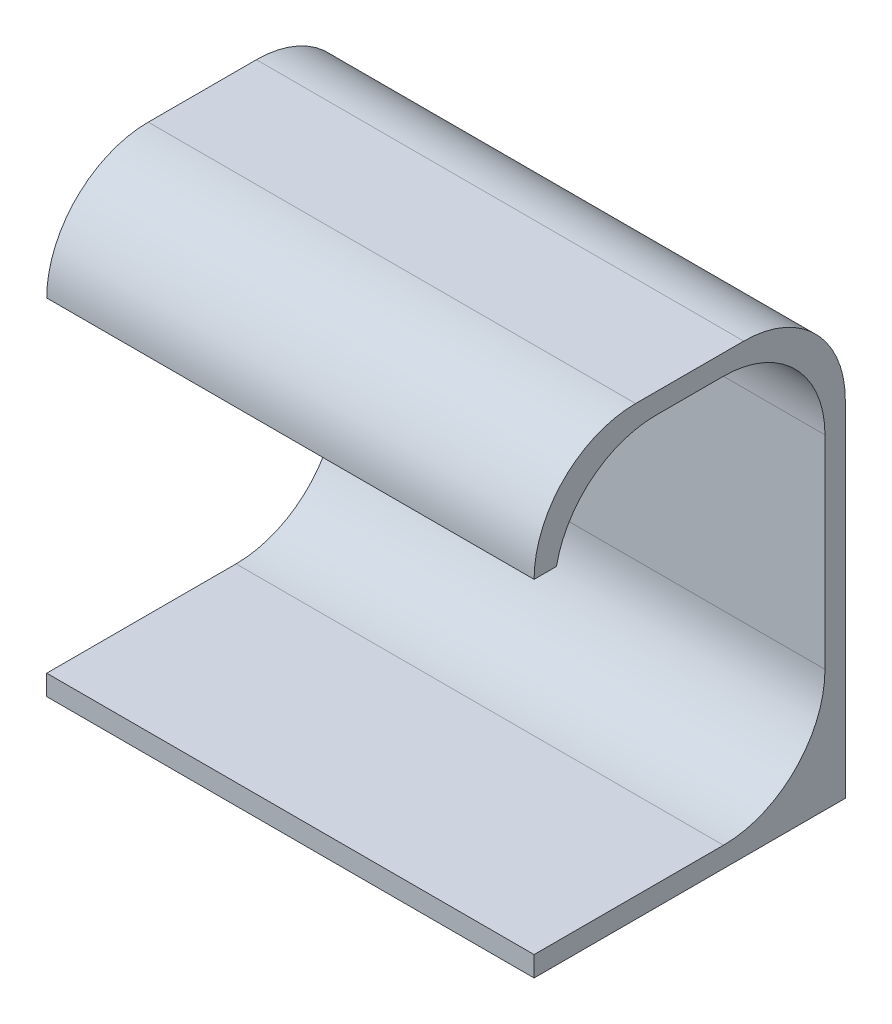
ISO-10303-21;
HEADER;
FILE_DESCRIPTION(('STEP AP214'),'2;1');
FILE_NAME('part.step','',(''),(''),'','','');
FILE_SCHEMA(('AUTOMOTIVE_DESIGN { 1 0 10303 214 1 1 1 1 }'));
ENDSEC;
DATA;
#1=APPLICATION_CONTEXT('core data for automotive mechanical design processes');
#2=APPLICATION_PROTOCOL_DEFINITION('international standard','automotive_design',2000,#1);
#3=PRODUCT_CONTEXT('',#1,'mechanical');
#4=PRODUCT('Part','Part','',(#3));
#5=PRODUCT_RELATED_PRODUCT_CATEGORY('part','',(#4));
#6=PRODUCT_DEFINITION_FORMATION('','',#4);
#7=PRODUCT_DEFINITION_CONTEXT('part definition',#1,'design');
#8=PRODUCT_DEFINITION('design','',#6,#7);
#9=PRODUCT_DEFINITION_SHAPE('','',#8);
#10=(LENGTH_UNIT() NAMED_UNIT(*) SI_UNIT(.MILLI.,.METRE.));
#11=(NAMED_UNIT(*) PLANE_ANGLE_UNIT() SI_UNIT($,.RADIAN.));
#12=(NAMED_UNIT(*) SI_UNIT($,.STERADIAN.) SOLID_ANGLE_UNIT());
#13=UNCERTAINTY_MEASURE_WITH_UNIT(LENGTH_MEASURE(1.E-05),#10,'distance_accuracy_value','');
#14=(GEOMETRIC_REPRESENTATION_CONTEXT(3) GLOBAL_UNCERTAINTY_ASSIGNED_CONTEXT((#13)) GLOBAL_UNIT_ASSIGNED_CONTEXT((#10,
#11,#12)) REPRESENTATION_CONTEXT('',''));
#15=CARTESIAN_POINT('',(0.,0.,0.));
#16=DIRECTION('',(0.,0.,1.));
#17=DIRECTION('',(1.,0.,0.));
#18=AXIS2_PLACEMENT_3D('',#15,#16,#17);
#19=CARTESIAN_POINT('',(48.,-2.,-17.25));
#20=DIRECTION('',(-1.,0.,0.));
#21=DIRECTION('',(0.,0.,1.));
#22=AXIS2_PLACEMENT_3D('',#19,#20,#21);
#23=PLANE('',#22);
#24=CARTESIAN_POINT('',(48.,-2.,-17.25));
#25=DIRECTION('',(1.,0.,0.));
#26=DIRECTION('',(0.,0.,1.));
#27=AXIS2_PLACEMENT_3D('',#24,#25,#26);
#28=CIRCLE('',#27,10.);
#29=CARTESIAN_POINT('',(48.,8.00000000000001,-17.25));
#30=VERTEX_POINT('',#29);
#31=CARTESIAN_POINT('',(48.,-2.,-7.25));
#32=VERTEX_POINT('',#31);
#33=EDGE_CURVE('E117',#30,#32,#28,.T.);
#34=ORIENTED_EDGE('',*,*,#33,.T.);
#35=DIRECTION('',(0.,0.,-1.));
#36=VECTOR('',#35,1.);
#37=CARTESIAN_POINT('',(48.,-2.,-17.25));
#38=LINE('',#37,#36);
#39=CARTESIAN_POINT('',(48.,-2.,-9.45204102886729));
#40=VERTEX_POINT('',#39);
#41=EDGE_CURVE('E158',#32,#40,#38,.T.);
#42=ORIENTED_EDGE('',*,*,#41,.T.);
#43=CARTESIAN_POINT('',(48.,-4.,-19.25));
#44=DIRECTION('',(1.,0.,0.));
#45=DIRECTION('',(0.,0.,1.));
#46=AXIS2_PLACEMENT_3D('',#43,#44,#45);
#47=CIRCLE('',#46,10.);
#48=CARTESIAN_POINT('',(48.,6.,-19.25));
#49=VERTEX_POINT('',#48);
#50=EDGE_CURVE('E206',#49,#40,#47,.T.);
#51=ORIENTED_EDGE('',*,*,#50,.F.);
#52=DIRECTION('',(0.,0.,1.));
#53=VECTOR('',#52,1.);
#54=CARTESIAN_POINT('',(48.,6.,-19.25));
#55=LINE('',#54,#53);
#56=CARTESIAN_POINT('',(48.,6.,-25.9));
#57=VERTEX_POINT('',#56);
#58=EDGE_CURVE('E204',#57,#49,#55,.T.);
#59=ORIENTED_EDGE('',*,*,#58,.F.);
#60=CARTESIAN_POINT('',(48.,-4.,-25.9));
#61=DIRECTION('',(1.,0.,0.));
#62=DIRECTION('',(0.,0.,1.));
#63=AXIS2_PLACEMENT_3D('',#60,#61,#62);
#64=CIRCLE('',#63,10.);
#65=CARTESIAN_POINT('',(48.,-4.,-35.9));
#66=VERTEX_POINT('',#65);
#67=EDGE_CURVE('E350',#66,#57,#64,.T.);
#68=ORIENTED_EDGE('',*,*,#67,.F.);
#69=DIRECTION('',(0.,1.,0.));
#70=VECTOR('',#69,1.);
#71=CARTESIAN_POINT('',(48.,-20.3,-35.9));
#72=LINE('',#71,#70);
#73=CARTESIAN_POINT('',(48.,-23.9999999999999,-35.9));
#74=VERTEX_POINT('',#73);
#75=EDGE_CURVE('E251',#74,#66,#72,.T.);
#76=ORIENTED_EDGE('',*,*,#75,.F.);
#77=CARTESIAN_POINT('',(48.,-24.,-25.9));
#78=DIRECTION('',(1.,0.,0.));
#79=DIRECTION('',(0.,0.,1.));
#80=AXIS2_PLACEMENT_3D('',#77,#78,#79);
#81=CIRCLE('',#80,10.);
#82=CARTESIAN_POINT('',(48.,-34.,-25.8999999999999));
#83=VERTEX_POINT('',#82);
#84=EDGE_CURVE('E347',#83,#74,#81,.T.);
#85=ORIENTED_EDGE('',*,*,#84,.F.);
#86=DIRECTION('',(0.,0.,-1.));
#87=VECTOR('',#86,1.);
#88=CARTESIAN_POINT('',(48.,-34.,-25.8999999999999));
#89=LINE('',#88,#87);
#90=CARTESIAN_POINT('',(48.,-34.,-7.25));
#91=VERTEX_POINT('',#90);
#92=EDGE_CURVE('E212',#91,#83,#89,.T.);
#93=ORIENTED_EDGE('',*,*,#92,.F.);
#94=DIRECTION('',(0.,-1.,0.));
#95=VECTOR('',#94,1.);
#96=CARTESIAN_POINT('',(48.,-36.,-7.25));
#97=LINE('',#96,#95);
#98=CARTESIAN_POINT('',(48.,-36.,-7.25));
#99=VERTEX_POINT('',#98);
#100=EDGE_CURVE('E89',#91,#99,#97,.T.);
#101=ORIENTED_EDGE('',*,*,#100,.T.);
#102=DIRECTION('',(0.,0.,-1.));
#103=VECTOR('',#102,1.);
#104=CARTESIAN_POINT('',(48.,-36.,-37.9));
#105=LINE('',#104,#103);
#106=CARTESIAN_POINT('',(48.,-36.,-37.9));
#107=VERTEX_POINT('',#106);
#108=EDGE_CURVE('E102',#99,#107,#105,.T.);
#109=ORIENTED_EDGE('',*,*,#108,.T.);
#110=DIRECTION('',(0.,1.,0.));
#111=VECTOR('',#110,1.);
#112=CARTESIAN_POINT('',(48.,-20.3,-37.9));
#113=LINE('',#112,#111);
#114=CARTESIAN_POINT('',(48.,-1.99999999999999,-37.9));
#115=VERTEX_POINT('',#114);
#116=EDGE_CURVE('E97',#107,#115,#113,.T.);
#117=ORIENTED_EDGE('',*,*,#116,.T.);
#118=CARTESIAN_POINT('',(48.,-2.,-27.9));
#119=DIRECTION('',(1.,0.,0.));
#120=DIRECTION('',(0.,0.,1.));
#121=AXIS2_PLACEMENT_3D('',#118,#119,#120);
#122=CIRCLE('',#121,10.);
#123=CARTESIAN_POINT('',(48.,8.,-27.9));
#124=VERTEX_POINT('',#123);
#125=EDGE_CURVE('E100',#115,#124,#122,.T.);
#126=ORIENTED_EDGE('',*,*,#125,.T.);
#127=DIRECTION('',(0.,0.,1.));
#128=VECTOR('',#127,1.);
#129=CARTESIAN_POINT('',(48.,8.,-17.25));
#130=LINE('',#129,#128);
#131=EDGE_CURVE('E57',#124,#30,#130,.T.);
#132=ORIENTED_EDGE('',*,*,#131,.T.);
#133=EDGE_LOOP('',(#34,#42,#51,#59,#68,#76,#85,#93,#101,#109,#117,#126,#132));
#134=FACE_BOUND('',#133,.T.);
#135=ADVANCED_FACE('F33',(#134),#23,.F.);
#136=CARTESIAN_POINT('',(0.,-2.,-17.25));
#137=DIRECTION('',(-1.,0.,0.));
#138=DIRECTION('',(0.,0.,1.));
#139=AXIS2_PLACEMENT_3D('',#136,#137,#138);
#140=PLANE('',#139);
#141=DIRECTION('',(0.,0.,-1.));
#142=VECTOR('',#141,1.);
#143=CARTESIAN_POINT('',(0.,-2.,-7.25));
#144=LINE('',#143,#142);
#145=CARTESIAN_POINT('',(0.,-2.,-7.25));
#146=VERTEX_POINT('',#145);
#147=CARTESIAN_POINT('',(0.,-2.,-9.45204102886729));
#148=VERTEX_POINT('',#147);
#149=EDGE_CURVE('E48',#146,#148,#144,.T.);
#150=ORIENTED_EDGE('',*,*,#149,.F.);
#151=CARTESIAN_POINT('',(0.,-2.,-17.25));
#152=DIRECTION('',(1.,0.,0.));
#153=DIRECTION('',(0.,0.,1.));
#154=AXIS2_PLACEMENT_3D('',#151,#152,#153);
#155=CIRCLE('',#154,10.);
#156=CARTESIAN_POINT('',(0.,8.00000000000001,-17.25));
#157=VERTEX_POINT('',#156);
#158=EDGE_CURVE('E131',#157,#146,#155,.T.);
#159=ORIENTED_EDGE('',*,*,#158,.F.);
#160=DIRECTION('',(0.,0.,1.));
#161=VECTOR('',#160,1.);
#162=CARTESIAN_POINT('',(0.,8.,-17.25));
#163=LINE('',#162,#161);
#164=CARTESIAN_POINT('',(0.,8.,-27.9));
#165=VERTEX_POINT('',#164);
#166=EDGE_CURVE('E81',#165,#157,#163,.T.);
#167=ORIENTED_EDGE('',*,*,#166,.F.);
#168=CARTESIAN_POINT('',(0.,-2.,-27.9));
#169=DIRECTION('',(1.,0.,0.));
#170=DIRECTION('',(0.,0.,1.));
#171=AXIS2_PLACEMENT_3D('',#168,#169,#170);
#172=CIRCLE('',#171,10.);
#173=CARTESIAN_POINT('',(0.,-1.99999999999999,-37.9));
#174=VERTEX_POINT('',#173);
#175=EDGE_CURVE('E128',#174,#165,#172,.T.);
#176=ORIENTED_EDGE('',*,*,#175,.F.);
#177=DIRECTION('',(0.,1.,0.));
#178=VECTOR('',#177,1.);
#179=CARTESIAN_POINT('',(0.,-1.99999999999999,-37.9));
#180=LINE('',#179,#178);
#181=CARTESIAN_POINT('',(0.,-36.,-37.9));
#182=VERTEX_POINT('',#181);
#183=EDGE_CURVE('E110',#182,#174,#180,.T.);
#184=ORIENTED_EDGE('',*,*,#183,.F.);
#185=DIRECTION('',(0.,0.,-1.));
#186=VECTOR('',#185,1.);
#187=CARTESIAN_POINT('',(0.,-36.,-37.9));
#188=LINE('',#187,#186);
#189=CARTESIAN_POINT('',(0.,-36.,-7.25));
#190=VERTEX_POINT('',#189);
#191=EDGE_CURVE('E123',#190,#182,#188,.T.);
#192=ORIENTED_EDGE('',*,*,#191,.F.);
#193=DIRECTION('',(0.,-1.,0.));
#194=VECTOR('',#193,1.);
#195=CARTESIAN_POINT('',(0.,-20.3,-7.25));
#196=LINE('',#195,#194);
#197=CARTESIAN_POINT('',(0.,-34.,-7.25));
#198=VERTEX_POINT('',#197);
#199=EDGE_CURVE('E134',#198,#190,#196,.T.);
#200=ORIENTED_EDGE('',*,*,#199,.F.);
#201=DIRECTION('',(0.,0.,-1.));
#202=VECTOR('',#201,1.);
#203=CARTESIAN_POINT('',(0.,-34.,-25.8999999999999));
#204=LINE('',#203,#202);
#205=CARTESIAN_POINT('',(0.,-34.,-25.8999999999999));
#206=VERTEX_POINT('',#205);
#207=EDGE_CURVE('E234',#198,#206,#204,.T.);
#208=ORIENTED_EDGE('',*,*,#207,.T.);
#209=CARTESIAN_POINT('',(0.,-24.,-25.9));
#210=DIRECTION('',(1.,0.,0.));
#211=DIRECTION('',(0.,0.,1.));
#212=AXIS2_PLACEMENT_3D('',#209,#210,#211);
#213=CIRCLE('',#212,10.);
#214=CARTESIAN_POINT('',(0.,-23.9999999999999,-35.9));
#215=VERTEX_POINT('',#214);
#216=EDGE_CURVE('E239',#206,#215,#213,.T.);
#217=ORIENTED_EDGE('',*,*,#216,.T.);
#218=DIRECTION('',(0.,1.,0.));
#219=VECTOR('',#218,1.);
#220=CARTESIAN_POINT('',(0.,-4.,-35.9));
#221=LINE('',#220,#219);
#222=CARTESIAN_POINT('',(0.,-4.,-35.9));
#223=VERTEX_POINT('',#222);
#224=EDGE_CURVE('E217',#215,#223,#221,.T.);
#225=ORIENTED_EDGE('',*,*,#224,.T.);
#226=CARTESIAN_POINT('',(0.,-4.,-25.9));
#227=DIRECTION('',(1.,0.,0.));
#228=DIRECTION('',(0.,0.,1.));
#229=AXIS2_PLACEMENT_3D('',#226,#227,#228);
#230=CIRCLE('',#229,10.);
#231=CARTESIAN_POINT('',(0.,6.,-25.9));
#232=VERTEX_POINT('',#231);
#233=EDGE_CURVE('E215',#223,#232,#230,.T.);
#234=ORIENTED_EDGE('',*,*,#233,.T.);
#235=DIRECTION('',(0.,0.,1.));
#236=VECTOR('',#235,1.);
#237=CARTESIAN_POINT('',(0.,6.,-19.25));
#238=LINE('',#237,#236);
#239=CARTESIAN_POINT('',(0.,6.,-19.25));
#240=VERTEX_POINT('',#239);
#241=EDGE_CURVE('E201',#232,#240,#238,.T.);
#242=ORIENTED_EDGE('',*,*,#241,.T.);
#243=CARTESIAN_POINT('',(0.,-4.,-19.25));
#244=DIRECTION('',(1.,0.,0.));
#245=DIRECTION('',(0.,0.,1.));
#246=AXIS2_PLACEMENT_3D('',#243,#244,#245);
#247=CIRCLE('',#246,10.);
#248=EDGE_CURVE('E209',#240,#148,#247,.T.);
#249=ORIENTED_EDGE('',*,*,#248,.T.);
#250=EDGE_LOOP('',(#150,#159,#167,#176,#184,#192,#200,#208,#217,#225,#234,#242,#249));
#251=FACE_BOUND('',#250,.T.);
#252=ADVANCED_FACE('F144',(#251),#140,.T.);
#253=CARTESIAN_POINT('',(48.,-36.,-37.9));
#254=DIRECTION('',(0.,1.,0.));
#255=DIRECTION('',(0.,0.,1.));
#256=AXIS2_PLACEMENT_3D('',#253,#254,#255);
#257=PLANE('',#256);
#258=ORIENTED_EDGE('',*,*,#191,.T.);
#259=DIRECTION('',(-1.,0.,0.));
#260=VECTOR('',#259,1.);
#261=CARTESIAN_POINT('',(48.,-36.,-37.9));
#262=LINE('',#261,#260);
#263=EDGE_CURVE('E41',#107,#182,#262,.T.);
#264=ORIENTED_EDGE('',*,*,#263,.F.);
#265=ORIENTED_EDGE('',*,*,#108,.F.);
#266=DIRECTION('',(-1.,0.,0.));
#267=VECTOR('',#266,1.);
#268=CARTESIAN_POINT('',(48.,-36.,-7.25));
#269=LINE('',#268,#267);
#270=EDGE_CURVE('E11',#99,#190,#269,.T.);
#271=ORIENTED_EDGE('',*,*,#270,.T.);
#272=EDGE_LOOP('',(#258,#264,#265,#271));
#273=FACE_BOUND('',#272,.T.);
#274=ADVANCED_FACE('F35',(#273),#257,.F.);
#275=CARTESIAN_POINT('',(48.,-1.99999999999999,-37.9));
#276=DIRECTION('',(0.,0.,1.));
#277=DIRECTION('',(0.,-1.,0.));
#278=AXIS2_PLACEMENT_3D('',#275,#276,#277);
#279=PLANE('',#278);
#280=ORIENTED_EDGE('',*,*,#183,.T.);
#281=DIRECTION('',(-1.,0.,0.));
#282=VECTOR('',#281,1.);
#283=CARTESIAN_POINT('',(48.,-1.99999999999999,-37.9));
#284=LINE('',#283,#282);
#285=EDGE_CURVE('E108',#115,#174,#284,.T.);
#286=ORIENTED_EDGE('',*,*,#285,.F.);
#287=ORIENTED_EDGE('',*,*,#116,.F.);
#288=ORIENTED_EDGE('',*,*,#263,.T.);
#289=EDGE_LOOP('',(#280,#286,#287,#288));
#290=FACE_BOUND('',#289,.T.);
#291=ADVANCED_FACE('F109',(#290),#279,.F.);
#292=CARTESIAN_POINT('',(48.,-2.,-27.9));
#293=DIRECTION('',(-1.,0.,0.));
#294=DIRECTION('',(0.,0.,1.));
#295=AXIS2_PLACEMENT_3D('',#292,#293,#294);
#296=CYLINDRICAL_SURFACE('',#295,10.);
#297=ORIENTED_EDGE('',*,*,#175,.T.);
#298=DIRECTION('',(-1.,0.,0.));
#299=VECTOR('',#298,1.);
#300=CARTESIAN_POINT('',(48.,8.,-27.9));
#301=LINE('',#300,#299);
#302=EDGE_CURVE('E113',#124,#165,#301,.T.);
#303=ORIENTED_EDGE('',*,*,#302,.F.);
#304=ORIENTED_EDGE('',*,*,#125,.F.);
#305=ORIENTED_EDGE('',*,*,#285,.T.);
#306=EDGE_LOOP('',(#297,#303,#304,#305));
#307=FACE_BOUND('',#306,.T.);
#308=ADVANCED_FACE('F115',(#307),#296,.T.);
#309=CARTESIAN_POINT('',(48.,8.,-17.25));
#310=DIRECTION('',(0.,-1.,0.));
#311=DIRECTION('',(0.,0.,-1.));
#312=AXIS2_PLACEMENT_3D('',#309,#310,#311);
#313=PLANE('',#312);
#314=ORIENTED_EDGE('',*,*,#166,.T.);
#315=DIRECTION('',(-1.,0.,0.));
#316=VECTOR('',#315,1.);
#317=CARTESIAN_POINT('',(48.,8.00000000000001,-17.25));
#318=LINE('',#317,#316);
#319=EDGE_CURVE('E137',#30,#157,#318,.T.);
#320=ORIENTED_EDGE('',*,*,#319,.F.);
#321=ORIENTED_EDGE('',*,*,#131,.F.);
#322=ORIENTED_EDGE('',*,*,#302,.T.);
#323=EDGE_LOOP('',(#314,#320,#321,#322));
#324=FACE_BOUND('',#323,.T.);
#325=ADVANCED_FACE('F148',(#324),#313,.F.);
#326=CARTESIAN_POINT('',(48.,-2.,-17.25));
#327=DIRECTION('',(-1.,0.,0.));
#328=DIRECTION('',(0.,0.,1.));
#329=AXIS2_PLACEMENT_3D('',#326,#327,#328);
#330=CYLINDRICAL_SURFACE('',#329,10.);
#331=ORIENTED_EDGE('',*,*,#158,.T.);
#332=DIRECTION('',(-1.,0.,0.));
#333=VECTOR('',#332,1.);
#334=CARTESIAN_POINT('',(48.,-2.,-7.25));
#335=LINE('',#334,#333);
#336=EDGE_CURVE('E122',#32,#146,#335,.T.);
#337=ORIENTED_EDGE('',*,*,#336,.F.);
#338=ORIENTED_EDGE('',*,*,#33,.F.);
#339=ORIENTED_EDGE('',*,*,#319,.T.);
#340=EDGE_LOOP('',(#331,#337,#338,#339));
#341=FACE_BOUND('',#340,.T.);
#342=ADVANCED_FACE('F152',(#341),#330,.T.);
#343=CARTESIAN_POINT('',(48.,-20.3,-7.25));
#344=DIRECTION('',(0.,0.,-1.));
#345=DIRECTION('',(0.,1.,0.));
#346=AXIS2_PLACEMENT_3D('',#343,#344,#345);
#347=PLANE('',#346);
#348=ORIENTED_EDGE('',*,*,#100,.F.);
#349=DIRECTION('',(-1.,0.,0.));
#350=VECTOR('',#349,1.);
#351=CARTESIAN_POINT('',(54.,-34.,-7.25));
#352=LINE('',#351,#350);
#353=EDGE_CURVE('E341',#91,#198,#352,.T.);
#354=ORIENTED_EDGE('',*,*,#353,.T.);
#355=ORIENTED_EDGE('',*,*,#199,.T.);
#356=ORIENTED_EDGE('',*,*,#270,.F.);
#357=EDGE_LOOP('',(#348,#354,#355,#356));
#358=FACE_BOUND('',#357,.T.);
#359=ADVANCED_FACE('F271',(#358),#347,.F.);
#360=CARTESIAN_POINT('',(48.,-34.,-25.8999999999999));
#361=DIRECTION('',(0.,1.,0.));
#362=DIRECTION('',(0.,0.,1.));
#363=AXIS2_PLACEMENT_3D('',#360,#361,#362);
#364=PLANE('',#363);
#365=ORIENTED_EDGE('',*,*,#207,.F.);
#366=ORIENTED_EDGE('',*,*,#353,.F.);
#367=ORIENTED_EDGE('',*,*,#92,.T.);
#368=DIRECTION('',(-1.,0.,0.));
#369=VECTOR('',#368,1.);
#370=CARTESIAN_POINT('',(48.,-34.,-25.8999999999999));
#371=LINE('',#370,#369);
#372=EDGE_CURVE('E126',#83,#206,#371,.T.);
#373=ORIENTED_EDGE('',*,*,#372,.T.);
#374=EDGE_LOOP('',(#365,#366,#367,#373));
#375=FACE_BOUND('',#374,.T.);
#376=ADVANCED_FACE('F232',(#375),#364,.T.);
#377=CARTESIAN_POINT('',(48.,-24.,-25.9));
#378=DIRECTION('',(-1.,0.,0.));
#379=DIRECTION('',(0.,0.,1.));
#380=AXIS2_PLACEMENT_3D('',#377,#378,#379);
#381=CYLINDRICAL_SURFACE('',#380,10.);
#382=ORIENTED_EDGE('',*,*,#216,.F.);
#383=ORIENTED_EDGE('',*,*,#372,.F.);
#384=ORIENTED_EDGE('',*,*,#84,.T.);
#385=DIRECTION('',(-1.,0.,0.));
#386=VECTOR('',#385,1.);
#387=CARTESIAN_POINT('',(48.,-23.9999999999999,-35.9));
#388=LINE('',#387,#386);
#389=EDGE_CURVE('E224',#74,#215,#388,.T.);
#390=ORIENTED_EDGE('',*,*,#389,.T.);
#391=EDGE_LOOP('',(#382,#383,#384,#390));
#392=FACE_BOUND('',#391,.T.);
#393=ADVANCED_FACE('F240',(#392),#381,.F.);
#394=CARTESIAN_POINT('',(48.,-4.,-35.9));
#395=DIRECTION('',(0.,0.,1.));
#396=DIRECTION('',(0.,-1.,0.));
#397=AXIS2_PLACEMENT_3D('',#394,#395,#396);
#398=PLANE('',#397);
#399=ORIENTED_EDGE('',*,*,#224,.F.);
#400=ORIENTED_EDGE('',*,*,#389,.F.);
#401=ORIENTED_EDGE('',*,*,#75,.T.);
#402=DIRECTION('',(-1.,0.,0.));
#403=VECTOR('',#402,1.);
#404=CARTESIAN_POINT('',(48.,-4.,-35.9));
#405=LINE('',#404,#403);
#406=EDGE_CURVE('E222',#66,#223,#405,.T.);
#407=ORIENTED_EDGE('',*,*,#406,.T.);
#408=EDGE_LOOP('',(#399,#400,#401,#407));
#409=FACE_BOUND('',#408,.T.);
#410=ADVANCED_FACE('F248',(#409),#398,.T.);
#411=CARTESIAN_POINT('',(48.,-4.,-25.9));
#412=DIRECTION('',(-1.,0.,0.));
#413=DIRECTION('',(0.,0.,1.));
#414=AXIS2_PLACEMENT_3D('',#411,#412,#413);
#415=CYLINDRICAL_SURFACE('',#414,10.);
#416=ORIENTED_EDGE('',*,*,#233,.F.);
#417=ORIENTED_EDGE('',*,*,#406,.F.);
#418=ORIENTED_EDGE('',*,*,#67,.T.);
#419=DIRECTION('',(-1.,0.,0.));
#420=VECTOR('',#419,1.);
#421=CARTESIAN_POINT('',(48.,6.,-25.9));
#422=LINE('',#421,#420);
#423=EDGE_CURVE('E192',#57,#232,#422,.T.);
#424=ORIENTED_EDGE('',*,*,#423,.T.);
#425=EDGE_LOOP('',(#416,#417,#418,#424));
#426=FACE_BOUND('',#425,.T.);
#427=ADVANCED_FACE('F253',(#426),#415,.F.);
#428=CARTESIAN_POINT('',(48.,6.,-19.25));
#429=DIRECTION('',(0.,-1.,0.));
#430=DIRECTION('',(0.,0.,-1.));
#431=AXIS2_PLACEMENT_3D('',#428,#429,#430);
#432=PLANE('',#431);
#433=ORIENTED_EDGE('',*,*,#241,.F.);
#434=ORIENTED_EDGE('',*,*,#423,.F.);
#435=ORIENTED_EDGE('',*,*,#58,.T.);
#436=DIRECTION('',(-1.,0.,0.));
#437=VECTOR('',#436,1.);
#438=CARTESIAN_POINT('',(48.,6.,-19.25));
#439=LINE('',#438,#437);
#440=EDGE_CURVE('E197',#49,#240,#439,.T.);
#441=ORIENTED_EDGE('',*,*,#440,.T.);
#442=EDGE_LOOP('',(#433,#434,#435,#441));
#443=FACE_BOUND('',#442,.T.);
#444=ADVANCED_FACE('F199',(#443),#432,.T.);
#445=CARTESIAN_POINT('',(48.,-4.,-19.25));
#446=DIRECTION('',(-1.,0.,0.));
#447=DIRECTION('',(0.,0.,1.));
#448=AXIS2_PLACEMENT_3D('',#445,#446,#447);
#449=CYLINDRICAL_SURFACE('',#448,10.);
#450=DIRECTION('',(-1.,0.,0.));
#451=VECTOR('',#450,1.);
#452=CARTESIAN_POINT('',(54.,-2.,-9.45204102886729));
#453=LINE('',#452,#451);
#454=EDGE_CURVE('E211',#40,#148,#453,.T.);
#455=ORIENTED_EDGE('',*,*,#454,.T.);
#456=ORIENTED_EDGE('',*,*,#248,.F.);
#457=ORIENTED_EDGE('',*,*,#440,.F.);
#458=ORIENTED_EDGE('',*,*,#50,.T.);
#459=EDGE_LOOP('',(#455,#456,#457,#458));
#460=FACE_BOUND('',#459,.T.);
#461=ADVANCED_FACE('F210',(#460),#449,.F.);
#462=CARTESIAN_POINT('',(54.,-2.,-7.25));
#463=DIRECTION('',(0.,1.,0.));
#464=DIRECTION('',(0.,0.,1.));
#465=AXIS2_PLACEMENT_3D('',#462,#463,#464);
#466=PLANE('',#465);
#467=ORIENTED_EDGE('',*,*,#336,.T.);
#468=ORIENTED_EDGE('',*,*,#149,.T.);
#469=ORIENTED_EDGE('',*,*,#454,.F.);
#470=ORIENTED_EDGE('',*,*,#41,.F.);
#471=EDGE_LOOP('',(#467,#468,#469,#470));
#472=FACE_BOUND('',#471,.T.);
#473=ADVANCED_FACE('F327',(#472),#466,.F.);
#474=CLOSED_SHELL('',(#135,#252,#274,#291,#308,#325,#342,#359,#376,#393,#410,#427,#444,#461,#473));
#475=MANIFOLD_SOLID_BREP('B2',#474);
#476=ADVANCED_BREP_SHAPE_REPRESENTATION('',(#18,#475),#14);
#477=SHAPE_DEFINITION_REPRESENTATION(#9,#476);
ENDSEC;
END-ISO-10303-21;
